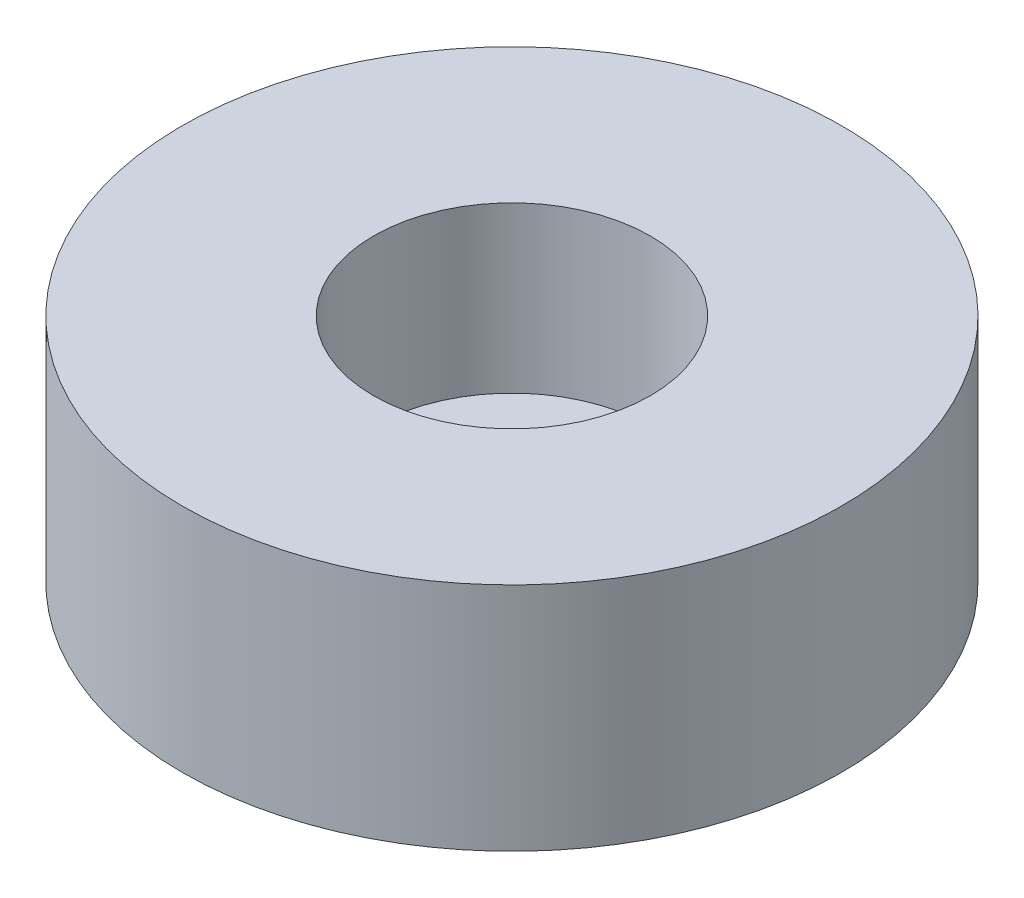
ISO-10303-21;
HEADER;
FILE_DESCRIPTION(('STEP AP214'),'2;1');
FILE_NAME('part.step','',(''),(''),'','','');
FILE_SCHEMA(('AUTOMOTIVE_DESIGN { 1 0 10303 214 1 1 1 1 }'));
ENDSEC;
DATA;
#1=APPLICATION_CONTEXT('core data for automotive mechanical design processes');
#2=APPLICATION_PROTOCOL_DEFINITION('international standard','automotive_design',2000,#1);
#3=PRODUCT_CONTEXT('',#1,'mechanical');
#4=PRODUCT('Part','Part','',(#3));
#5=PRODUCT_RELATED_PRODUCT_CATEGORY('part','',(#4));
#6=PRODUCT_DEFINITION_FORMATION('','',#4);
#7=PRODUCT_DEFINITION_CONTEXT('part definition',#1,'design');
#8=PRODUCT_DEFINITION('design','',#6,#7);
#9=PRODUCT_DEFINITION_SHAPE('','',#8);
#10=(LENGTH_UNIT() NAMED_UNIT(*) SI_UNIT(.MILLI.,.METRE.));
#11=(NAMED_UNIT(*) PLANE_ANGLE_UNIT() SI_UNIT($,.RADIAN.));
#12=(NAMED_UNIT(*) SI_UNIT($,.STERADIAN.) SOLID_ANGLE_UNIT());
#13=UNCERTAINTY_MEASURE_WITH_UNIT(LENGTH_MEASURE(1.E-05),#10,'distance_accuracy_value','');
#14=(GEOMETRIC_REPRESENTATION_CONTEXT(3) GLOBAL_UNCERTAINTY_ASSIGNED_CONTEXT((#13)) GLOBAL_UNIT_ASSIGNED_CONTEXT((#10,
#11,#12)) REPRESENTATION_CONTEXT('',''));
#15=CARTESIAN_POINT('',(0.,0.,0.));
#16=DIRECTION('',(0.,0.,1.));
#17=DIRECTION('',(1.,0.,0.));
#18=AXIS2_PLACEMENT_3D('',#15,#16,#17);
#19=CARTESIAN_POINT('',(0.,5.,0.));
#20=DIRECTION('',(0.,1.,0.));
#21=DIRECTION('',(0.,0.,1.));
#22=AXIS2_PLACEMENT_3D('',#19,#20,#21);
#23=PLANE('',#22);
#24=CARTESIAN_POINT('',(0.,5.,0.));
#25=DIRECTION('',(0.,1.,0.));
#26=DIRECTION('',(0.,0.,1.));
#27=AXIS2_PLACEMENT_3D('',#24,#25,#26);
#28=CIRCLE('',#27,10.);
#29=CARTESIAN_POINT('',(0.,5.,10.));
#30=VERTEX_POINT('',#29);
#31=EDGE_CURVE('E10',#30,#30,#28,.T.);
#32=ORIENTED_EDGE('',*,*,#31,.T.);
#33=EDGE_LOOP('',(#32));
#34=FACE_BOUND('',#33,.T.);
#35=CARTESIAN_POINT('',(0.,5.,0.));
#36=DIRECTION('',(0.,1.,0.));
#37=DIRECTION('',(0.,0.,1.));
#38=AXIS2_PLACEMENT_3D('',#35,#36,#37);
#39=CIRCLE('',#38,4.2);
#40=CARTESIAN_POINT('',(0.,5.,4.2));
#41=VERTEX_POINT('',#40);
#42=EDGE_CURVE('E49',#41,#41,#39,.T.);
#43=ORIENTED_EDGE('',*,*,#42,.F.);
#44=EDGE_LOOP('',(#43));
#45=FACE_BOUND('',#44,.T.);
#46=ADVANCED_FACE('F41',(#34,#45),#23,.T.);
#47=CARTESIAN_POINT('',(0.,5.,0.));
#48=DIRECTION('',(0.,-1.,0.));
#49=DIRECTION('',(0.,0.,-1.));
#50=AXIS2_PLACEMENT_3D('',#47,#48,#49);
#51=CYLINDRICAL_SURFACE('',#50,10.);
#52=ORIENTED_EDGE('',*,*,#31,.F.);
#53=EDGE_LOOP('',(#52));
#54=FACE_BOUND('',#53,.T.);
#55=CARTESIAN_POINT('',(0.,-2.,0.));
#56=DIRECTION('',(0.,1.,0.));
#57=DIRECTION('',(0.,0.,1.));
#58=AXIS2_PLACEMENT_3D('',#55,#56,#57);
#59=CIRCLE('',#58,10.);
#60=CARTESIAN_POINT('',(0.,-2.,10.));
#61=VERTEX_POINT('',#60);
#62=EDGE_CURVE('E61',#61,#61,#59,.T.);
#63=ORIENTED_EDGE('',*,*,#62,.T.);
#64=EDGE_LOOP('',(#63));
#65=FACE_BOUND('',#64,.T.);
#66=ADVANCED_FACE('F43',(#54,#65),#51,.T.);
#67=CARTESIAN_POINT('',(0.,5.,0.));
#68=DIRECTION('',(0.,-1.,0.));
#69=DIRECTION('',(0.,0.,-1.));
#70=AXIS2_PLACEMENT_3D('',#67,#68,#69);
#71=CYLINDRICAL_SURFACE('',#70,4.2);
#72=ORIENTED_EDGE('',*,*,#42,.T.);
#73=EDGE_LOOP('',(#72));
#74=FACE_BOUND('',#73,.T.);
#75=CARTESIAN_POINT('',(0.,0.,0.));
#76=DIRECTION('',(0.,1.,0.));
#77=DIRECTION('',(0.,0.,1.));
#78=AXIS2_PLACEMENT_3D('',#75,#76,#77);
#79=CIRCLE('',#78,4.2);
#80=CARTESIAN_POINT('',(0.,0.,4.2));
#81=VERTEX_POINT('',#80);
#82=EDGE_CURVE('E55',#81,#81,#79,.T.);
#83=ORIENTED_EDGE('',*,*,#82,.F.);
#84=EDGE_LOOP('',(#83));
#85=FACE_BOUND('',#84,.T.);
#86=ADVANCED_FACE('F73',(#74,#85),#71,.F.);
#87=CARTESIAN_POINT('',(0.,0.,0.));
#88=DIRECTION('',(0.,1.,0.));
#89=DIRECTION('',(0.,0.,1.));
#90=AXIS2_PLACEMENT_3D('',#87,#88,#89);
#91=PLANE('',#90);
#92=ORIENTED_EDGE('',*,*,#82,.T.);
#93=EDGE_LOOP('',(#92));
#94=FACE_BOUND('',#93,.T.);
#95=ADVANCED_FACE('F69',(#94),#91,.T.);
#96=CARTESIAN_POINT('',(0.,-2.,0.));
#97=DIRECTION('',(0.,1.,0.));
#98=DIRECTION('',(0.,0.,1.));
#99=AXIS2_PLACEMENT_3D('',#96,#97,#98);
#100=PLANE('',#99);
#101=ORIENTED_EDGE('',*,*,#62,.F.);
#102=EDGE_LOOP('',(#101));
#103=FACE_BOUND('',#102,.T.);
#104=ADVANCED_FACE('F67',(#103),#100,.F.);
#105=CLOSED_SHELL('',(#46,#66,#86,#95,#104));
#106=MANIFOLD_SOLID_BREP('B2',#105);
#107=ADVANCED_BREP_SHAPE_REPRESENTATION('',(#18,#106),#14);
#108=SHAPE_DEFINITION_REPRESENTATION(#9,#107);
ENDSEC;
END-ISO-10303-21;
